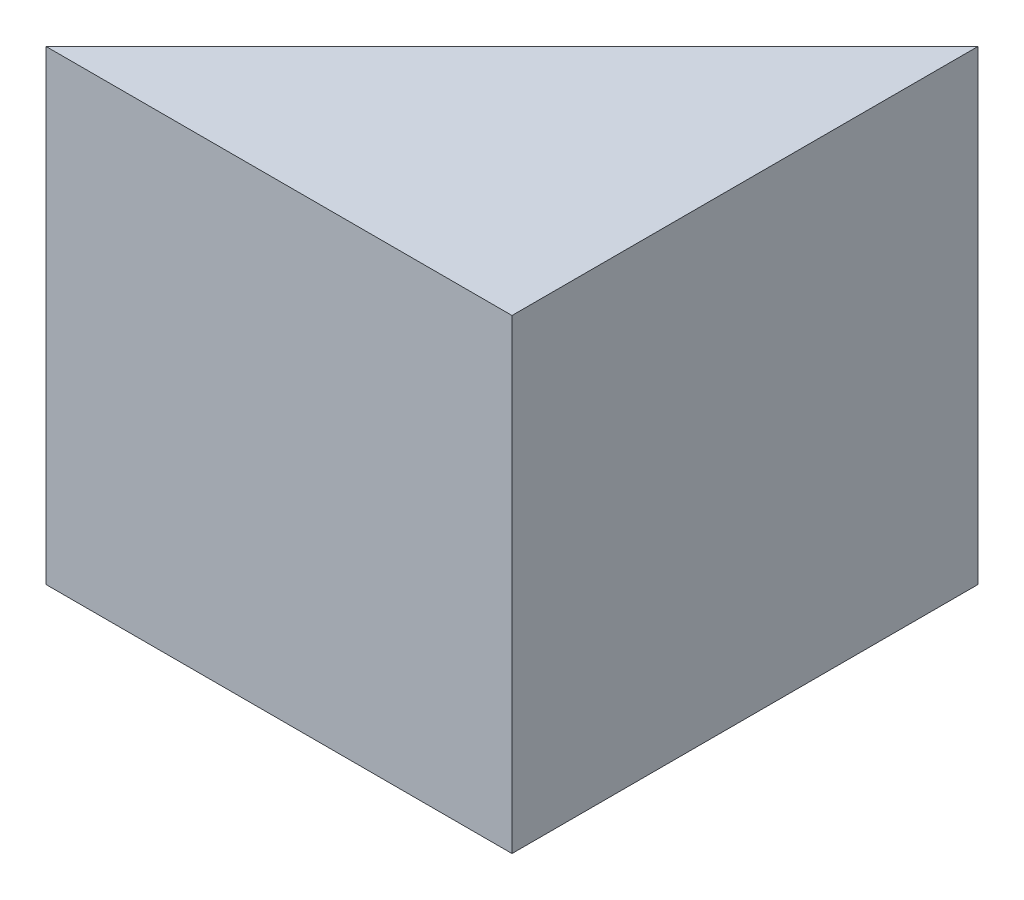
ISO-10303-21;
HEADER;
FILE_DESCRIPTION(('STEP AP214'),'2;1');
FILE_NAME('part.step','',(''),(''),'','','');
FILE_SCHEMA(('AUTOMOTIVE_DESIGN { 1 0 10303 214 1 1 1 1 }'));
ENDSEC;
DATA;
#1=APPLICATION_CONTEXT('core data for automotive mechanical design processes');
#2=APPLICATION_PROTOCOL_DEFINITION('international standard','automotive_design',2000,#1);
#3=PRODUCT_CONTEXT('',#1,'mechanical');
#4=PRODUCT('Part','Part','',(#3));
#5=PRODUCT_RELATED_PRODUCT_CATEGORY('part','',(#4));
#6=PRODUCT_DEFINITION_FORMATION('','',#4);
#7=PRODUCT_DEFINITION_CONTEXT('part definition',#1,'design');
#8=PRODUCT_DEFINITION('design','',#6,#7);
#9=PRODUCT_DEFINITION_SHAPE('','',#8);
#10=(LENGTH_UNIT() NAMED_UNIT(*) SI_UNIT(.MILLI.,.METRE.));
#11=(NAMED_UNIT(*) PLANE_ANGLE_UNIT() SI_UNIT($,.RADIAN.));
#12=(NAMED_UNIT(*) SI_UNIT($,.STERADIAN.) SOLID_ANGLE_UNIT());
#13=UNCERTAINTY_MEASURE_WITH_UNIT(LENGTH_MEASURE(1.E-05),#10,'distance_accuracy_value','');
#14=(GEOMETRIC_REPRESENTATION_CONTEXT(3) GLOBAL_UNCERTAINTY_ASSIGNED_CONTEXT((#13)) GLOBAL_UNIT_ASSIGNED_CONTEXT((#10,
#11,#12)) REPRESENTATION_CONTEXT('',''));
#15=CARTESIAN_POINT('',(0.,0.,0.));
#16=DIRECTION('',(0.,0.,1.));
#17=DIRECTION('',(1.,0.,0.));
#18=AXIS2_PLACEMENT_3D('',#15,#16,#17);
#19=CARTESIAN_POINT('',(0.,1.,0.));
#20=DIRECTION('',(0.,-1.,0.));
#21=DIRECTION('',(0.,0.,-1.));
#22=AXIS2_PLACEMENT_3D('',#19,#20,#21);
#23=PLANE('',#22);
#24=DIRECTION('',(-0.707106781186547,0.,0.707106781186548));
#25=VECTOR('',#24,1.);
#26=CARTESIAN_POINT('',(0.,1.,0.));
#27=LINE('',#26,#25);
#28=CARTESIAN_POINT('',(1.,1.,-1.));
#29=VERTEX_POINT('',#28);
#30=CARTESIAN_POINT('',(0.,1.,0.));
#31=VERTEX_POINT('',#30);
#32=EDGE_CURVE('E101',#29,#31,#27,.T.);
#33=ORIENTED_EDGE('',*,*,#32,.T.);
#34=DIRECTION('',(1.,0.,0.));
#35=VECTOR('',#34,1.);
#36=CARTESIAN_POINT('',(0.,1.,0.));
#37=LINE('',#36,#35);
#38=CARTESIAN_POINT('',(1.,1.,0.));
#39=VERTEX_POINT('',#38);
#40=EDGE_CURVE('E103',#31,#39,#37,.T.);
#41=ORIENTED_EDGE('',*,*,#40,.T.);
#42=DIRECTION('',(0.,0.,-1.));
#43=VECTOR('',#42,1.);
#44=CARTESIAN_POINT('',(1.,1.,0.));
#45=LINE('',#44,#43);
#46=EDGE_CURVE('E91',#39,#29,#45,.T.);
#47=ORIENTED_EDGE('',*,*,#46,.T.);
#48=EDGE_LOOP('',(#33,#41,#47));
#49=FACE_BOUND('',#48,.T.);
#50=ADVANCED_FACE('F39',(#49),#23,.F.);
#51=CARTESIAN_POINT('',(0.,1.,0.));
#52=DIRECTION('',(1.,0.,0.));
#53=DIRECTION('',(0.,0.,-1.));
#54=AXIS2_PLACEMENT_3D('',#51,#52,#53);
#55=PLANE('',#54);
#56=DIRECTION('',(0.,-1.,0.));
#57=VECTOR('',#56,1.);
#58=CARTESIAN_POINT('',(0.,1.,0.));
#59=LINE('',#58,#57);
#60=CARTESIAN_POINT('',(0.,0.5,0.));
#61=VERTEX_POINT('',#60);
#62=CARTESIAN_POINT('',(0.,0.,0.));
#63=VERTEX_POINT('',#62);
#64=EDGE_CURVE('E48',#61,#63,#59,.T.);
#65=ORIENTED_EDGE('',*,*,#64,.F.);
#66=DIRECTION('',(0.,0.,1.));
#67=VECTOR('',#66,1.);
#68=CARTESIAN_POINT('',(0.,0.5,0.));
#69=LINE('',#68,#67);
#70=CARTESIAN_POINT('',(0.,0.5,-1.));
#71=VERTEX_POINT('',#70);
#72=EDGE_CURVE('E117',#71,#61,#69,.T.);
#73=ORIENTED_EDGE('',*,*,#72,.F.);
#74=DIRECTION('',(0.,-1.,0.));
#75=VECTOR('',#74,1.);
#76=CARTESIAN_POINT('',(0.,1.,-1.));
#77=LINE('',#76,#75);
#78=CARTESIAN_POINT('',(0.,0.,-1.));
#79=VERTEX_POINT('',#78);
#80=EDGE_CURVE('E106',#71,#79,#77,.T.);
#81=ORIENTED_EDGE('',*,*,#80,.T.);
#82=DIRECTION('',(0.,0.,1.));
#83=VECTOR('',#82,1.);
#84=CARTESIAN_POINT('',(0.,0.,0.));
#85=LINE('',#84,#83);
#86=EDGE_CURVE('E115',#79,#63,#85,.T.);
#87=ORIENTED_EDGE('',*,*,#86,.T.);
#88=EDGE_LOOP('',(#65,#73,#81,#87));
#89=FACE_BOUND('',#88,.T.);
#90=ADVANCED_FACE('F41',(#89),#55,.F.);
#91=CARTESIAN_POINT('',(0.,1.,0.));
#92=DIRECTION('',(0.,0.,-1.));
#93=DIRECTION('',(-1.,0.,0.));
#94=AXIS2_PLACEMENT_3D('',#91,#92,#93);
#95=PLANE('',#94);
#96=DIRECTION('',(1.,0.,0.));
#97=VECTOR('',#96,1.);
#98=CARTESIAN_POINT('',(0.,0.,0.));
#99=LINE('',#98,#97);
#100=CARTESIAN_POINT('',(1.,0.,0.));
#101=VERTEX_POINT('',#100);
#102=EDGE_CURVE('E128',#63,#101,#99,.T.);
#103=ORIENTED_EDGE('',*,*,#102,.T.);
#104=DIRECTION('',(0.,-1.,0.));
#105=VECTOR('',#104,1.);
#106=CARTESIAN_POINT('',(1.,1.,0.));
#107=LINE('',#106,#105);
#108=EDGE_CURVE('E98',#39,#101,#107,.T.);
#109=ORIENTED_EDGE('',*,*,#108,.F.);
#110=ORIENTED_EDGE('',*,*,#40,.F.);
#111=EDGE_CURVE('E11',#31,#61,#59,.T.);
#112=ORIENTED_EDGE('',*,*,#111,.T.);
#113=ORIENTED_EDGE('',*,*,#64,.T.);
#114=EDGE_LOOP('',(#103,#109,#110,#112,#113));
#115=FACE_BOUND('',#114,.T.);
#116=ADVANCED_FACE('F143',(#115),#95,.F.);
#117=CARTESIAN_POINT('',(1.,1.,0.));
#118=DIRECTION('',(-1.,0.,0.));
#119=DIRECTION('',(0.,0.,1.));
#120=AXIS2_PLACEMENT_3D('',#117,#118,#119);
#121=PLANE('',#120);
#122=DIRECTION('',(0.,0.,-1.));
#123=VECTOR('',#122,1.);
#124=CARTESIAN_POINT('',(1.,0.,0.));
#125=LINE('',#124,#123);
#126=CARTESIAN_POINT('',(1.,0.,-1.));
#127=VERTEX_POINT('',#126);
#128=EDGE_CURVE('E131',#101,#127,#125,.T.);
#129=ORIENTED_EDGE('',*,*,#128,.T.);
#130=DIRECTION('',(0.,-1.,0.));
#131=VECTOR('',#130,1.);
#132=CARTESIAN_POINT('',(1.,1.,-1.));
#133=LINE('',#132,#131);
#134=CARTESIAN_POINT('',(1.,0.5,-1.));
#135=VERTEX_POINT('',#134);
#136=EDGE_CURVE('E92',#135,#127,#133,.T.);
#137=ORIENTED_EDGE('',*,*,#136,.F.);
#138=EDGE_CURVE('E86',#29,#135,#133,.T.);
#139=ORIENTED_EDGE('',*,*,#138,.F.);
#140=ORIENTED_EDGE('',*,*,#46,.F.);
#141=ORIENTED_EDGE('',*,*,#108,.T.);
#142=EDGE_LOOP('',(#129,#137,#139,#140,#141));
#143=FACE_BOUND('',#142,.T.);
#144=ADVANCED_FACE('F89',(#143),#121,.F.);
#145=CARTESIAN_POINT('',(0.,1.,-1.));
#146=DIRECTION('',(0.,0.,1.));
#147=DIRECTION('',(1.,0.,0.));
#148=AXIS2_PLACEMENT_3D('',#145,#146,#147);
#149=PLANE('',#148);
#150=ORIENTED_EDGE('',*,*,#80,.F.);
#151=DIRECTION('',(-1.,0.,0.));
#152=VECTOR('',#151,1.);
#153=CARTESIAN_POINT('',(0.,0.5,-1.));
#154=LINE('',#153,#152);
#155=EDGE_CURVE('E61',#135,#71,#154,.T.);
#156=ORIENTED_EDGE('',*,*,#155,.F.);
#157=ORIENTED_EDGE('',*,*,#136,.T.);
#158=DIRECTION('',(-1.,0.,0.));
#159=VECTOR('',#158,1.);
#160=CARTESIAN_POINT('',(0.,0.,-1.));
#161=LINE('',#160,#159);
#162=EDGE_CURVE('E124',#127,#79,#161,.T.);
#163=ORIENTED_EDGE('',*,*,#162,.T.);
#164=EDGE_LOOP('',(#150,#156,#157,#163));
#165=FACE_BOUND('',#164,.T.);
#166=ADVANCED_FACE('F148',(#165),#149,.F.);
#167=CARTESIAN_POINT('',(0.,0.,0.));
#168=DIRECTION('',(0.,-1.,0.));
#169=DIRECTION('',(0.,0.,-1.));
#170=AXIS2_PLACEMENT_3D('',#167,#168,#169);
#171=PLANE('',#170);
#172=ORIENTED_EDGE('',*,*,#86,.F.);
#173=ORIENTED_EDGE('',*,*,#162,.F.);
#174=ORIENTED_EDGE('',*,*,#128,.F.);
#175=ORIENTED_EDGE('',*,*,#102,.F.);
#176=EDGE_LOOP('',(#172,#173,#174,#175));
#177=FACE_BOUND('',#176,.T.);
#178=ADVANCED_FACE('F146',(#177),#171,.T.);
#179=CARTESIAN_POINT('',(0.,4.4150635094611,0.));
#180=DIRECTION('',(-0.707106781186548,0.,-0.707106781186547));
#181=DIRECTION('',(-0.707106781186547,0.,0.707106781186548));
#182=AXIS2_PLACEMENT_3D('',#179,#180,#181);
#183=PLANE('',#182);
#184=ORIENTED_EDGE('',*,*,#32,.F.);
#185=ORIENTED_EDGE('',*,*,#138,.T.);
#186=DIRECTION('',(-0.707106781186547,0.,0.707106781186548));
#187=VECTOR('',#186,1.);
#188=CARTESIAN_POINT('',(0.,0.5,0.));
#189=LINE('',#188,#187);
#190=EDGE_CURVE('E111',#135,#61,#189,.T.);
#191=ORIENTED_EDGE('',*,*,#190,.T.);
#192=ORIENTED_EDGE('',*,*,#111,.F.);
#193=EDGE_LOOP('',(#184,#185,#191,#192));
#194=FACE_BOUND('',#193,.T.);
#195=ADVANCED_FACE('F109',(#194),#183,.T.);
#196=CARTESIAN_POINT('',(0.,0.5,0.));
#197=DIRECTION('',(0.,-1.,0.));
#198=DIRECTION('',(0.,0.,-1.));
#199=AXIS2_PLACEMENT_3D('',#196,#197,#198);
#200=PLANE('',#199);
#201=ORIENTED_EDGE('',*,*,#72,.T.);
#202=ORIENTED_EDGE('',*,*,#190,.F.);
#203=ORIENTED_EDGE('',*,*,#155,.T.);
#204=EDGE_LOOP('',(#201,#202,#203));
#205=FACE_BOUND('',#204,.T.);
#206=ADVANCED_FACE('F164',(#205),#200,.F.);
#207=CLOSED_SHELL('',(#50,#90,#116,#144,#166,#178,#195,#206));
#208=MANIFOLD_SOLID_BREP('B2',#207);
#209=ADVANCED_BREP_SHAPE_REPRESENTATION('',(#18,#208),#14);
#210=SHAPE_DEFINITION_REPRESENTATION(#9,#209);
ENDSEC;
END-ISO-10303-21;
